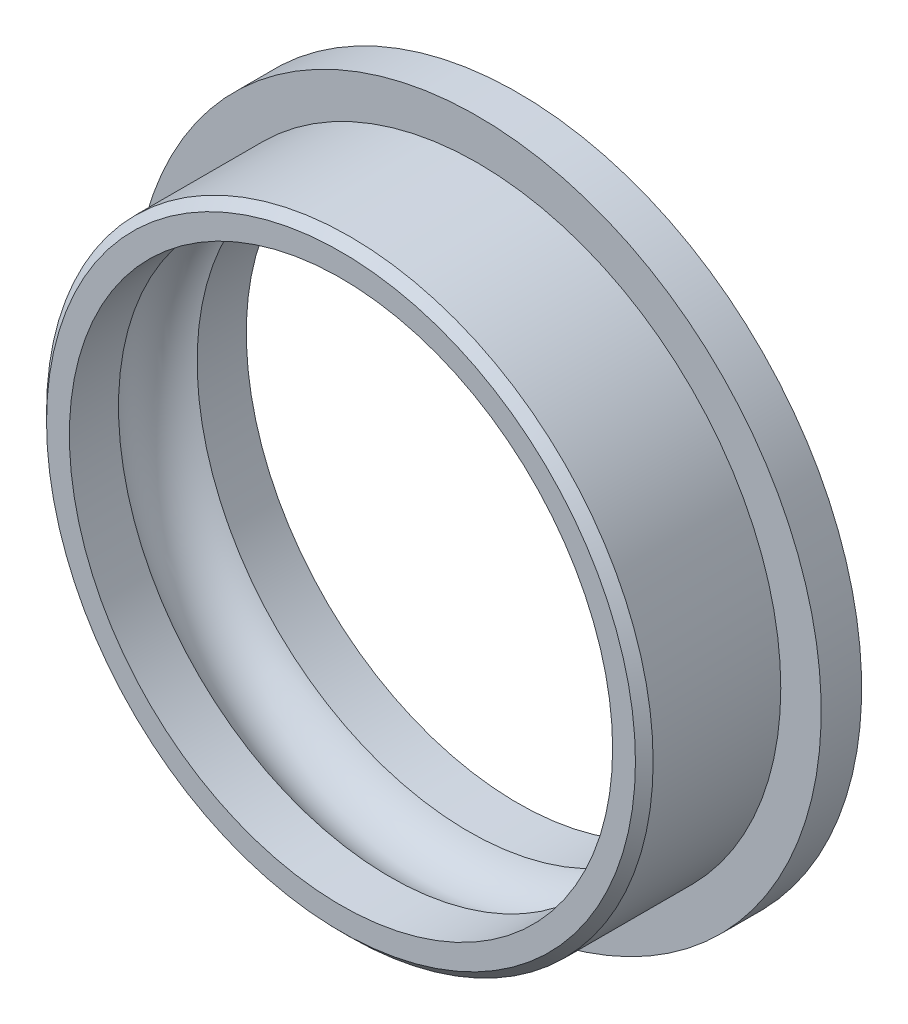
ISO-10303-21;
HEADER;
FILE_DESCRIPTION(('STEP AP214'),'2;1');
FILE_NAME('part.step','',(''),(''),'','','');
FILE_SCHEMA(('AUTOMOTIVE_DESIGN { 1 0 10303 214 1 1 1 1 }'));
ENDSEC;
DATA;
#1=APPLICATION_CONTEXT('core data for automotive mechanical design processes');
#2=APPLICATION_PROTOCOL_DEFINITION('international standard','automotive_design',2000,#1);
#3=PRODUCT_CONTEXT('',#1,'mechanical');
#4=PRODUCT('Part','Part','',(#3));
#5=PRODUCT_RELATED_PRODUCT_CATEGORY('part','',(#4));
#6=PRODUCT_DEFINITION_FORMATION('','',#4);
#7=PRODUCT_DEFINITION_CONTEXT('part definition',#1,'design');
#8=PRODUCT_DEFINITION('design','',#6,#7);
#9=PRODUCT_DEFINITION_SHAPE('','',#8);
#10=(LENGTH_UNIT() NAMED_UNIT(*) SI_UNIT(.MILLI.,.METRE.));
#11=(NAMED_UNIT(*) PLANE_ANGLE_UNIT() SI_UNIT($,.RADIAN.));
#12=(NAMED_UNIT(*) SI_UNIT($,.STERADIAN.) SOLID_ANGLE_UNIT());
#13=UNCERTAINTY_MEASURE_WITH_UNIT(LENGTH_MEASURE(1.E-05),#10,'distance_accuracy_value','');
#14=(GEOMETRIC_REPRESENTATION_CONTEXT(3) GLOBAL_UNCERTAINTY_ASSIGNED_CONTEXT((#13)) GLOBAL_UNIT_ASSIGNED_CONTEXT((#10,
#11,#12)) REPRESENTATION_CONTEXT('',''));
#15=CARTESIAN_POINT('',(0.,0.,0.));
#16=DIRECTION('',(0.,0.,1.));
#17=DIRECTION('',(1.,0.,0.));
#18=AXIS2_PLACEMENT_3D('',#15,#16,#17);
#19=CARTESIAN_POINT('',(0.,5.825,1.75));
#20=DIRECTION('',(0.,0.,-1.));
#21=DIRECTION('',(-1.,0.,0.));
#22=AXIS2_PLACEMENT_3D('',#19,#20,#21);
#23=PLANE('',#22);
#24=CARTESIAN_POINT('',(0.,0.,1.75000000001546));
#25=DIRECTION('',(0.,0.,-1.));
#26=DIRECTION('',(-1.,0.,0.));
#27=AXIS2_PLACEMENT_3D('',#24,#25,#26);
#28=CIRCLE('',#27,5.82499999995889);
#29=CARTESIAN_POINT('',(-5.82499999995889,0.,1.75000000001546));
#30=VERTEX_POINT('',#29);
#31=EDGE_CURVE('E18',#30,#30,#28,.T.);
#32=ORIENTED_EDGE('',*,*,#31,.F.);
#33=EDGE_LOOP('',(#32));
#34=FACE_BOUND('',#33,.T.);
#35=CARTESIAN_POINT('',(0.,0.,1.75));
#36=DIRECTION('',(0.,0.,1.));
#37=DIRECTION('',(1.,0.,0.));
#38=AXIS2_PLACEMENT_3D('',#35,#36,#37);
#39=CIRCLE('',#38,5.37362637362637);
#40=CARTESIAN_POINT('',(5.37362637362637,0.,1.75));
#41=VERTEX_POINT('',#40);
#42=EDGE_CURVE('E39',#41,#41,#39,.F.);
#43=ORIENTED_EDGE('',*,*,#42,.T.);
#44=EDGE_LOOP('',(#43));
#45=FACE_BOUND('',#44,.T.);
#46=ADVANCED_FACE('F15',(#34,#45),#23,.F.);
#47=CARTESIAN_POINT('',(0.,0.,1.57500000005939));
#48=DIRECTION('',(0.,0.,-1.));
#49=DIRECTION('',(-1.,0.,0.));
#50=AXIS2_PLACEMENT_3D('',#47,#48,#49);
#51=CONICAL_SURFACE('',#50,5.99999999991496,0.785398163397448);
#52=ORIENTED_EDGE('',*,*,#31,.T.);
#53=EDGE_LOOP('',(#52));
#54=FACE_BOUND('',#53,.T.);
#55=CARTESIAN_POINT('',(0.,0.,1.575));
#56=DIRECTION('',(0.,0.,1.));
#57=DIRECTION('',(1.,0.,0.));
#58=AXIS2_PLACEMENT_3D('',#55,#56,#57);
#59=CIRCLE('',#58,6.);
#60=CARTESIAN_POINT('',(6.,0.,1.575));
#61=VERTEX_POINT('',#60);
#62=EDGE_CURVE('E30',#61,#61,#59,.F.);
#63=ORIENTED_EDGE('',*,*,#62,.F.);
#64=EDGE_LOOP('',(#63));
#65=FACE_BOUND('',#64,.T.);
#66=ADVANCED_FACE('F47',(#54,#65),#51,.T.);
#67=CARTESIAN_POINT('',(0.,0.,1.75));
#68=DIRECTION('',(0.,0.,1.));
#69=DIRECTION('',(1.,0.,0.));
#70=AXIS2_PLACEMENT_3D('',#67,#68,#69);
#71=CYLINDRICAL_SURFACE('',#70,5.37362637362637);
#72=CARTESIAN_POINT('',(0.,0.,0.777777777777777));
#73=DIRECTION('',(0.,0.,1.));
#74=DIRECTION('',(1.,0.,0.));
#75=AXIS2_PLACEMENT_3D('',#72,#73,#74);
#76=CIRCLE('',#75,5.37362637362637);
#77=CARTESIAN_POINT('',(5.37362637362637,0.,0.777777777777777));
#78=VERTEX_POINT('',#77);
#79=EDGE_CURVE('E38',#78,#78,#76,.F.);
#80=ORIENTED_EDGE('',*,*,#79,.T.);
#81=EDGE_LOOP('',(#80));
#82=FACE_BOUND('',#81,.T.);
#83=ORIENTED_EDGE('',*,*,#42,.F.);
#84=EDGE_LOOP('',(#83));
#85=FACE_BOUND('',#84,.T.);
#86=ADVANCED_FACE('F55',(#82,#85),#71,.F.);
#87=CARTESIAN_POINT('',(0.,0.,1.75));
#88=DIRECTION('',(0.,0.,1.));
#89=DIRECTION('',(1.,0.,0.));
#90=AXIS2_PLACEMENT_3D('',#87,#88,#89);
#91=CYLINDRICAL_SURFACE('',#90,6.);
#92=CARTESIAN_POINT('',(0.,0.,-0.95));
#93=DIRECTION('',(0.,0.,1.));
#94=DIRECTION('',(1.,0.,0.));
#95=AXIS2_PLACEMENT_3D('',#92,#93,#94);
#96=CIRCLE('',#95,6.);
#97=CARTESIAN_POINT('',(6.,0.,-0.95));
#98=VERTEX_POINT('',#97);
#99=EDGE_CURVE('E36',#98,#98,#96,.F.);
#100=ORIENTED_EDGE('',*,*,#99,.F.);
#101=EDGE_LOOP('',(#100));
#102=FACE_BOUND('',#101,.T.);
#103=ORIENTED_EDGE('',*,*,#62,.T.);
#104=EDGE_LOOP('',(#103));
#105=FACE_BOUND('',#104,.T.);
#106=ADVANCED_FACE('F79',(#102,#105),#91,.T.);
#107=CARTESIAN_POINT('',(0.,0.,0.));
#108=DIRECTION('',(0.,0.,1.));
#109=DIRECTION('',(1.,0.,0.));
#110=AXIS2_PLACEMENT_3D('',#107,#108,#109);
#111=TOROIDAL_SURFACE('',#110,5.,0.862864380232568);
#112=CARTESIAN_POINT('',(0.,0.,-0.777777777777777));
#113=DIRECTION('',(0.,0.,1.));
#114=DIRECTION('',(1.,0.,0.));
#115=AXIS2_PLACEMENT_3D('',#112,#113,#114);
#116=CIRCLE('',#115,5.37362637362637);
#117=CARTESIAN_POINT('',(5.37362637362637,0.,-0.777777777777777));
#118=VERTEX_POINT('',#117);
#119=EDGE_CURVE('E35',#118,#118,#116,.F.);
#120=ORIENTED_EDGE('',*,*,#119,.T.);
#121=EDGE_LOOP('',(#120));
#122=FACE_BOUND('',#121,.T.);
#123=ORIENTED_EDGE('',*,*,#79,.F.);
#124=EDGE_LOOP('',(#123));
#125=FACE_BOUND('',#124,.T.);
#126=ADVANCED_FACE('F74',(#122,#125),#111,.F.);
#127=CARTESIAN_POINT('',(0.,5.37362637362638,-0.95));
#128=DIRECTION('',(0.,0.,1.));
#129=DIRECTION('',(1.,0.,0.));
#130=AXIS2_PLACEMENT_3D('',#127,#128,#129);
#131=PLANE('',#130);
#132=ORIENTED_EDGE('',*,*,#99,.T.);
#133=EDGE_LOOP('',(#132));
#134=FACE_BOUND('',#133,.T.);
#135=CARTESIAN_POINT('',(0.,0.,-0.95));
#136=DIRECTION('',(0.,0.,-1.));
#137=DIRECTION('',(-1.,0.,0.));
#138=AXIS2_PLACEMENT_3D('',#135,#136,#137);
#139=CIRCLE('',#138,6.8);
#140=CARTESIAN_POINT('',(-6.8,0.,-0.95));
#141=VERTEX_POINT('',#140);
#142=EDGE_CURVE('E27',#141,#141,#139,.T.);
#143=ORIENTED_EDGE('',*,*,#142,.F.);
#144=EDGE_LOOP('',(#143));
#145=FACE_BOUND('',#144,.T.);
#146=ADVANCED_FACE('F70',(#134,#145),#131,.T.);
#147=CARTESIAN_POINT('',(0.,0.,1.75));
#148=DIRECTION('',(0.,0.,1.));
#149=DIRECTION('',(1.,0.,0.));
#150=AXIS2_PLACEMENT_3D('',#147,#148,#149);
#151=CYLINDRICAL_SURFACE('',#150,5.37362637362637);
#152=CARTESIAN_POINT('',(0.,0.,-1.75));
#153=DIRECTION('',(0.,0.,1.));
#154=DIRECTION('',(1.,0.,0.));
#155=AXIS2_PLACEMENT_3D('',#152,#153,#154);
#156=CIRCLE('',#155,5.37362637362637);
#157=CARTESIAN_POINT('',(5.37362637362637,0.,-1.75));
#158=VERTEX_POINT('',#157);
#159=EDGE_CURVE('E22',#158,#158,#156,.F.);
#160=ORIENTED_EDGE('',*,*,#159,.T.);
#161=EDGE_LOOP('',(#160));
#162=FACE_BOUND('',#161,.T.);
#163=ORIENTED_EDGE('',*,*,#119,.F.);
#164=EDGE_LOOP('',(#163));
#165=FACE_BOUND('',#164,.T.);
#166=ADVANCED_FACE('F64',(#162,#165),#151,.F.);
#167=CARTESIAN_POINT('',(0.,0.,-1.75));
#168=DIRECTION('',(0.,0.,-1.));
#169=DIRECTION('',(-1.,0.,0.));
#170=AXIS2_PLACEMENT_3D('',#167,#168,#169);
#171=CYLINDRICAL_SURFACE('',#170,6.8);
#172=CARTESIAN_POINT('',(0.,0.,-1.75));
#173=DIRECTION('',(0.,0.,-1.));
#174=DIRECTION('',(-1.,0.,0.));
#175=AXIS2_PLACEMENT_3D('',#172,#173,#174);
#176=CIRCLE('',#175,6.8);
#177=CARTESIAN_POINT('',(-6.8,0.,-1.75));
#178=VERTEX_POINT('',#177);
#179=EDGE_CURVE('E10',#178,#178,#176,.F.);
#180=ORIENTED_EDGE('',*,*,#179,.T.);
#181=EDGE_LOOP('',(#180));
#182=FACE_BOUND('',#181,.T.);
#183=ORIENTED_EDGE('',*,*,#142,.T.);
#184=EDGE_LOOP('',(#183));
#185=FACE_BOUND('',#184,.T.);
#186=ADVANCED_FACE('F58',(#182,#185),#171,.T.);
#187=CARTESIAN_POINT('',(0.,5.825,-1.75));
#188=DIRECTION('',(0.,0.,1.));
#189=DIRECTION('',(1.,0.,0.));
#190=AXIS2_PLACEMENT_3D('',#187,#188,#189);
#191=PLANE('',#190);
#192=ORIENTED_EDGE('',*,*,#179,.F.);
#193=EDGE_LOOP('',(#192));
#194=FACE_BOUND('',#193,.T.);
#195=ORIENTED_EDGE('',*,*,#159,.F.);
#196=EDGE_LOOP('',(#195));
#197=FACE_BOUND('',#196,.T.);
#198=ADVANCED_FACE('F56',(#194,#197),#191,.F.);
#199=CLOSED_SHELL('',(#46,#66,#86,#106,#126,#146,#166,#186,#198));
#200=MANIFOLD_SOLID_BREP('B1',#199);
#201=ADVANCED_BREP_SHAPE_REPRESENTATION('',(#18,#200),#14);
#202=SHAPE_DEFINITION_REPRESENTATION(#9,#201);
ENDSEC;
END-ISO-10303-21;
